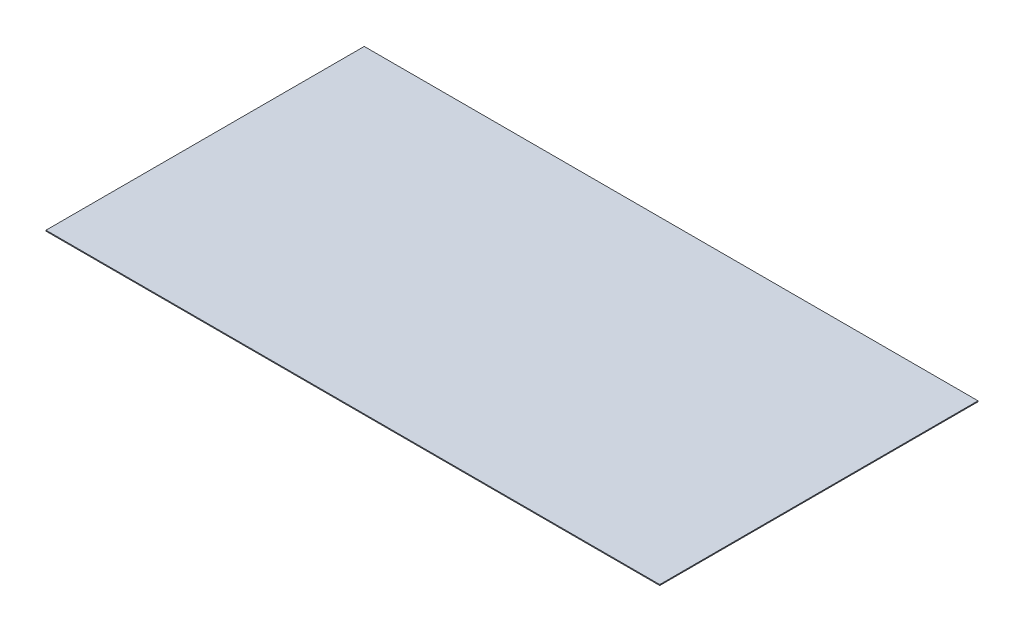
ISO-10303-21;
HEADER;
FILE_DESCRIPTION(('STEP AP214'),'2;1');
FILE_NAME('part.step','',(''),(''),'','','');
FILE_SCHEMA(('AUTOMOTIVE_DESIGN { 1 0 10303 214 1 1 1 1 }'));
ENDSEC;
DATA;
#1=APPLICATION_CONTEXT('core data for automotive mechanical design processes');
#2=APPLICATION_PROTOCOL_DEFINITION('international standard','automotive_design',2000,#1);
#3=PRODUCT_CONTEXT('',#1,'mechanical');
#4=PRODUCT('Part','Part','',(#3));
#5=PRODUCT_RELATED_PRODUCT_CATEGORY('part','',(#4));
#6=PRODUCT_DEFINITION_FORMATION('','',#4);
#7=PRODUCT_DEFINITION_CONTEXT('part definition',#1,'design');
#8=PRODUCT_DEFINITION('design','',#6,#7);
#9=PRODUCT_DEFINITION_SHAPE('','',#8);
#10=(LENGTH_UNIT() NAMED_UNIT(*) SI_UNIT(.MILLI.,.METRE.));
#11=(NAMED_UNIT(*) PLANE_ANGLE_UNIT() SI_UNIT($,.RADIAN.));
#12=(NAMED_UNIT(*) SI_UNIT($,.STERADIAN.) SOLID_ANGLE_UNIT());
#13=UNCERTAINTY_MEASURE_WITH_UNIT(LENGTH_MEASURE(1.E-05),#10,'distance_accuracy_value','');
#14=(GEOMETRIC_REPRESENTATION_CONTEXT(3) GLOBAL_UNCERTAINTY_ASSIGNED_CONTEXT((#13)) GLOBAL_UNIT_ASSIGNED_CONTEXT((#10,
#11,#12)) REPRESENTATION_CONTEXT('',''));
#15=CARTESIAN_POINT('',(0.,0.,0.));
#16=DIRECTION('',(0.,0.,1.));
#17=DIRECTION('',(1.,0.,0.));
#18=AXIS2_PLACEMENT_3D('',#15,#16,#17);
#19=CARTESIAN_POINT('',(0.,2.,0.));
#20=DIRECTION('',(1.,0.,0.));
#21=DIRECTION('',(0.,0.,-1.));
#22=AXIS2_PLACEMENT_3D('',#19,#20,#21);
#23=PLANE('',#22);
#24=DIRECTION('',(0.,0.,1.));
#25=VECTOR('',#24,1.);
#26=CARTESIAN_POINT('',(0.,0.,0.));
#27=LINE('',#26,#25);
#28=CARTESIAN_POINT('',(0.,0.,-700.));
#29=VERTEX_POINT('',#28);
#30=CARTESIAN_POINT('',(0.,0.,0.));
#31=VERTEX_POINT('',#30);
#32=EDGE_CURVE('E108',#29,#31,#27,.T.);
#33=ORIENTED_EDGE('',*,*,#32,.T.);
#34=DIRECTION('',(0.,-1.,0.));
#35=VECTOR('',#34,1.);
#36=CARTESIAN_POINT('',(0.,2.,0.));
#37=LINE('',#36,#35);
#38=CARTESIAN_POINT('',(0.,2.,0.));
#39=VERTEX_POINT('',#38);
#40=EDGE_CURVE('E11',#39,#31,#37,.T.);
#41=ORIENTED_EDGE('',*,*,#40,.F.);
#42=DIRECTION('',(0.,0.,1.));
#43=VECTOR('',#42,1.);
#44=CARTESIAN_POINT('',(0.,2.,0.));
#45=LINE('',#44,#43);
#46=CARTESIAN_POINT('',(0.,2.,-700.));
#47=VERTEX_POINT('',#46);
#48=EDGE_CURVE('E92',#47,#39,#45,.T.);
#49=ORIENTED_EDGE('',*,*,#48,.F.);
#50=DIRECTION('',(0.,-1.,0.));
#51=VECTOR('',#50,1.);
#52=CARTESIAN_POINT('',(0.,2.,-700.));
#53=LINE('',#52,#51);
#54=EDGE_CURVE('E105',#47,#29,#53,.T.);
#55=ORIENTED_EDGE('',*,*,#54,.T.);
#56=EDGE_LOOP('',(#33,#41,#49,#55));
#57=FACE_BOUND('',#56,.T.);
#58=ADVANCED_FACE('F43',(#57),#23,.F.);
#59=CARTESIAN_POINT('',(0.,2.,0.));
#60=DIRECTION('',(0.,0.,-1.));
#61=DIRECTION('',(-1.,0.,0.));
#62=AXIS2_PLACEMENT_3D('',#59,#60,#61);
#63=PLANE('',#62);
#64=DIRECTION('',(1.,0.,0.));
#65=VECTOR('',#64,1.);
#66=CARTESIAN_POINT('',(0.,0.,0.));
#67=LINE('',#66,#65);
#68=CARTESIAN_POINT('',(1350.,0.,0.));
#69=VERTEX_POINT('',#68);
#70=EDGE_CURVE('E97',#31,#69,#67,.T.);
#71=ORIENTED_EDGE('',*,*,#70,.T.);
#72=DIRECTION('',(0.,-1.,0.));
#73=VECTOR('',#72,1.);
#74=CARTESIAN_POINT('',(1350.,2.,0.));
#75=LINE('',#74,#73);
#76=CARTESIAN_POINT('',(1350.,2.,0.));
#77=VERTEX_POINT('',#76);
#78=EDGE_CURVE('E51',#77,#69,#75,.T.);
#79=ORIENTED_EDGE('',*,*,#78,.F.);
#80=DIRECTION('',(1.,0.,0.));
#81=VECTOR('',#80,1.);
#82=CARTESIAN_POINT('',(0.,2.,0.));
#83=LINE('',#82,#81);
#84=EDGE_CURVE('E87',#39,#77,#83,.T.);
#85=ORIENTED_EDGE('',*,*,#84,.F.);
#86=ORIENTED_EDGE('',*,*,#40,.T.);
#87=EDGE_LOOP('',(#71,#79,#85,#86));
#88=FACE_BOUND('',#87,.T.);
#89=ADVANCED_FACE('F100',(#88),#63,.F.);
#90=CARTESIAN_POINT('',(1350.,2.,0.));
#91=DIRECTION('',(-1.,0.,0.));
#92=DIRECTION('',(0.,0.,1.));
#93=AXIS2_PLACEMENT_3D('',#90,#91,#92);
#94=PLANE('',#93);
#95=DIRECTION('',(0.,0.,-1.));
#96=VECTOR('',#95,1.);
#97=CARTESIAN_POINT('',(1350.,0.,0.));
#98=LINE('',#97,#96);
#99=CARTESIAN_POINT('',(1350.,0.,-700.));
#100=VERTEX_POINT('',#99);
#101=EDGE_CURVE('E78',#69,#100,#98,.T.);
#102=ORIENTED_EDGE('',*,*,#101,.T.);
#103=DIRECTION('',(0.,-1.,0.));
#104=VECTOR('',#103,1.);
#105=CARTESIAN_POINT('',(1350.,2.,-700.));
#106=LINE('',#105,#104);
#107=CARTESIAN_POINT('',(1350.,2.,-700.));
#108=VERTEX_POINT('',#107);
#109=EDGE_CURVE('E98',#108,#100,#106,.T.);
#110=ORIENTED_EDGE('',*,*,#109,.F.);
#111=DIRECTION('',(0.,0.,-1.));
#112=VECTOR('',#111,1.);
#113=CARTESIAN_POINT('',(1350.,2.,0.));
#114=LINE('',#113,#112);
#115=EDGE_CURVE('E95',#77,#108,#114,.T.);
#116=ORIENTED_EDGE('',*,*,#115,.F.);
#117=ORIENTED_EDGE('',*,*,#78,.T.);
#118=EDGE_LOOP('',(#102,#110,#116,#117));
#119=FACE_BOUND('',#118,.T.);
#120=ADVANCED_FACE('F99',(#119),#94,.F.);
#121=CARTESIAN_POINT('',(0.,2.,-700.));
#122=DIRECTION('',(0.,0.,1.));
#123=DIRECTION('',(1.,0.,0.));
#124=AXIS2_PLACEMENT_3D('',#121,#122,#123);
#125=PLANE('',#124);
#126=DIRECTION('',(-1.,0.,0.));
#127=VECTOR('',#126,1.);
#128=CARTESIAN_POINT('',(0.,0.,-700.));
#129=LINE('',#128,#127);
#130=EDGE_CURVE('E85',#100,#29,#129,.T.);
#131=ORIENTED_EDGE('',*,*,#130,.T.);
#132=ORIENTED_EDGE('',*,*,#54,.F.);
#133=DIRECTION('',(-1.,0.,0.));
#134=VECTOR('',#133,1.);
#135=CARTESIAN_POINT('',(0.,2.,-700.));
#136=LINE('',#135,#134);
#137=EDGE_CURVE('E56',#108,#47,#136,.T.);
#138=ORIENTED_EDGE('',*,*,#137,.F.);
#139=ORIENTED_EDGE('',*,*,#109,.T.);
#140=EDGE_LOOP('',(#131,#132,#138,#139));
#141=FACE_BOUND('',#140,.T.);
#142=ADVANCED_FACE('F111',(#141),#125,.F.);
#143=CARTESIAN_POINT('',(0.,2.,0.));
#144=DIRECTION('',(0.,-1.,0.));
#145=DIRECTION('',(0.,0.,-1.));
#146=AXIS2_PLACEMENT_3D('',#143,#144,#145);
#147=PLANE('',#146);
#148=ORIENTED_EDGE('',*,*,#48,.T.);
#149=ORIENTED_EDGE('',*,*,#84,.T.);
#150=ORIENTED_EDGE('',*,*,#115,.T.);
#151=ORIENTED_EDGE('',*,*,#137,.T.);
#152=EDGE_LOOP('',(#148,#149,#150,#151));
#153=FACE_BOUND('',#152,.T.);
#154=ADVANCED_FACE('F89',(#153),#147,.F.);
#155=CARTESIAN_POINT('',(0.,0.,0.));
#156=DIRECTION('',(0.,-1.,0.));
#157=DIRECTION('',(0.,0.,-1.));
#158=AXIS2_PLACEMENT_3D('',#155,#156,#157);
#159=PLANE('',#158);
#160=ORIENTED_EDGE('',*,*,#32,.F.);
#161=ORIENTED_EDGE('',*,*,#130,.F.);
#162=ORIENTED_EDGE('',*,*,#101,.F.);
#163=ORIENTED_EDGE('',*,*,#70,.F.);
#164=EDGE_LOOP('',(#160,#161,#162,#163));
#165=FACE_BOUND('',#164,.T.);
#166=ADVANCED_FACE('F118',(#165),#159,.T.);
#167=CLOSED_SHELL('',(#58,#89,#120,#142,#154,#166));
#168=MANIFOLD_SOLID_BREP('B2',#167);
#169=ADVANCED_BREP_SHAPE_REPRESENTATION('',(#18,#168),#14);
#170=SHAPE_DEFINITION_REPRESENTATION(#9,#169);
ENDSEC;
END-ISO-10303-21;
